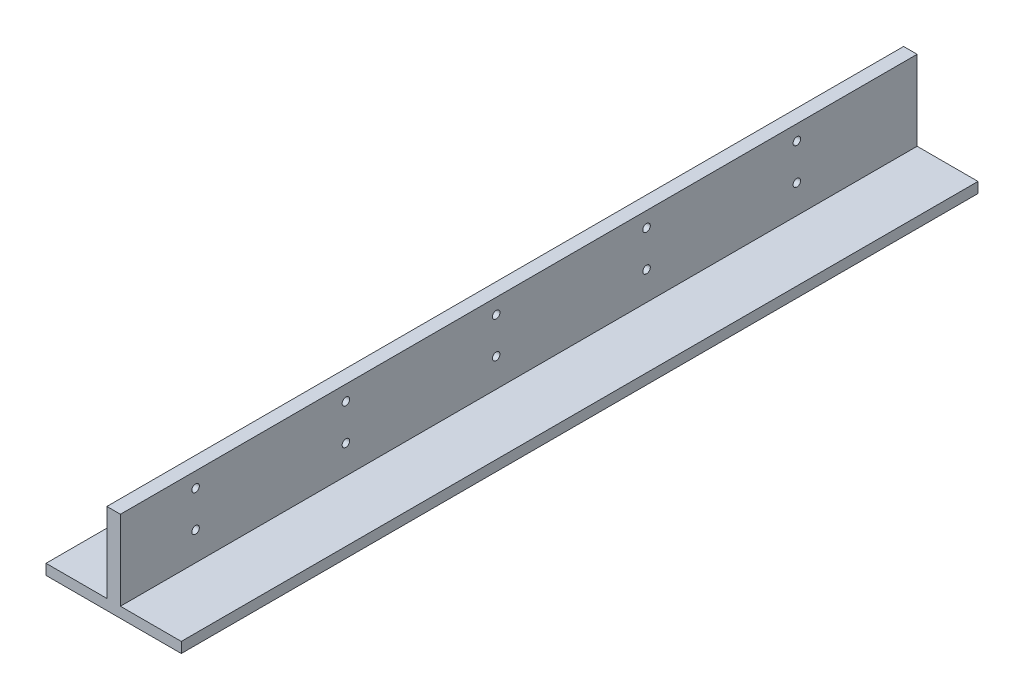
ISO-10303-21;
HEADER;
FILE_DESCRIPTION(('STEP AP214'),'2;1');
FILE_NAME('part.step','',(''),(''),'','','');
FILE_SCHEMA(('AUTOMOTIVE_DESIGN { 1 0 10303 214 1 1 1 1 }'));
ENDSEC;
DATA;
#1=APPLICATION_CONTEXT('core data for automotive mechanical design processes');
#2=APPLICATION_PROTOCOL_DEFINITION('international standard','automotive_design',2000,#1);
#3=PRODUCT_CONTEXT('',#1,'mechanical');
#4=PRODUCT('Part','Part','',(#3));
#5=PRODUCT_RELATED_PRODUCT_CATEGORY('part','',(#4));
#6=PRODUCT_DEFINITION_FORMATION('','',#4);
#7=PRODUCT_DEFINITION_CONTEXT('part definition',#1,'design');
#8=PRODUCT_DEFINITION('design','',#6,#7);
#9=PRODUCT_DEFINITION_SHAPE('','',#8);
#10=(LENGTH_UNIT() NAMED_UNIT(*) SI_UNIT(.MILLI.,.METRE.));
#11=(NAMED_UNIT(*) PLANE_ANGLE_UNIT() SI_UNIT($,.RADIAN.));
#12=(NAMED_UNIT(*) SI_UNIT($,.STERADIAN.) SOLID_ANGLE_UNIT());
#13=UNCERTAINTY_MEASURE_WITH_UNIT(LENGTH_MEASURE(1.E-05),#10,'distance_accuracy_value','');
#14=(GEOMETRIC_REPRESENTATION_CONTEXT(3) GLOBAL_UNCERTAINTY_ASSIGNED_CONTEXT((#13)) GLOBAL_UNIT_ASSIGNED_CONTEXT((#10,
#11,#12)) REPRESENTATION_CONTEXT('',''));
#15=CARTESIAN_POINT('',(0.,0.,0.));
#16=DIRECTION('',(0.,0.,1.));
#17=DIRECTION('',(1.,0.,0.));
#18=AXIS2_PLACEMENT_3D('',#15,#16,#17);
#19=CARTESIAN_POINT('',(0.,7.,530.));
#20=DIRECTION('',(1.,0.,0.));
#21=DIRECTION('',(0.,0.,-1.));
#22=AXIS2_PLACEMENT_3D('',#19,#20,#21);
#23=PLANE('',#22);
#24=DIRECTION('',(0.,-1.,0.));
#25=VECTOR('',#24,1.);
#26=CARTESIAN_POINT('',(0.,7.,0.));
#27=LINE('',#26,#25);
#28=CARTESIAN_POINT('',(0.,7.,0.));
#29=VERTEX_POINT('',#28);
#30=CARTESIAN_POINT('',(0.,0.,0.));
#31=VERTEX_POINT('',#30);
#32=EDGE_CURVE('E129',#29,#31,#27,.T.);
#33=ORIENTED_EDGE('',*,*,#32,.T.);
#34=DIRECTION('',(0.,0.,-1.));
#35=VECTOR('',#34,1.);
#36=CARTESIAN_POINT('',(0.,0.,530.));
#37=LINE('',#36,#35);
#38=CARTESIAN_POINT('',(0.,0.,530.));
#39=VERTEX_POINT('',#38);
#40=EDGE_CURVE('E11',#39,#31,#37,.T.);
#41=ORIENTED_EDGE('',*,*,#40,.F.);
#42=DIRECTION('',(0.,-1.,0.));
#43=VECTOR('',#42,1.);
#44=CARTESIAN_POINT('',(0.,7.,530.));
#45=LINE('',#44,#43);
#46=CARTESIAN_POINT('',(0.,7.,530.));
#47=VERTEX_POINT('',#46);
#48=EDGE_CURVE('E144',#47,#39,#45,.T.);
#49=ORIENTED_EDGE('',*,*,#48,.F.);
#50=DIRECTION('',(0.,0.,-1.));
#51=VECTOR('',#50,1.);
#52=CARTESIAN_POINT('',(0.,7.,530.));
#53=LINE('',#52,#51);
#54=EDGE_CURVE('E125',#47,#29,#53,.T.);
#55=ORIENTED_EDGE('',*,*,#54,.T.);
#56=EDGE_LOOP('',(#33,#41,#49,#55));
#57=FACE_BOUND('',#56,.T.);
#58=ADVANCED_FACE('F33',(#57),#23,.F.);
#59=CARTESIAN_POINT('',(0.,0.,530.));
#60=DIRECTION('',(0.,1.,0.));
#61=DIRECTION('',(0.,0.,1.));
#62=AXIS2_PLACEMENT_3D('',#59,#60,#61);
#63=PLANE('',#62);
#64=DIRECTION('',(1.,0.,0.));
#65=VECTOR('',#64,1.);
#66=CARTESIAN_POINT('',(0.,0.,0.));
#67=LINE('',#66,#65);
#68=CARTESIAN_POINT('',(90.,0.,0.));
#69=VERTEX_POINT('',#68);
#70=EDGE_CURVE('E132',#31,#69,#67,.T.);
#71=ORIENTED_EDGE('',*,*,#70,.T.);
#72=DIRECTION('',(0.,0.,-1.));
#73=VECTOR('',#72,1.);
#74=CARTESIAN_POINT('',(90.,0.,530.));
#75=LINE('',#74,#73);
#76=CARTESIAN_POINT('',(90.,0.,530.));
#77=VERTEX_POINT('',#76);
#78=EDGE_CURVE('E41',#77,#69,#75,.T.);
#79=ORIENTED_EDGE('',*,*,#78,.F.);
#80=DIRECTION('',(1.,0.,0.));
#81=VECTOR('',#80,1.);
#82=CARTESIAN_POINT('',(0.,0.,530.));
#83=LINE('',#82,#81);
#84=EDGE_CURVE('E92',#39,#77,#83,.T.);
#85=ORIENTED_EDGE('',*,*,#84,.F.);
#86=ORIENTED_EDGE('',*,*,#40,.T.);
#87=EDGE_LOOP('',(#71,#79,#85,#86));
#88=FACE_BOUND('',#87,.T.);
#89=ADVANCED_FACE('F284',(#88),#63,.F.);
#90=CARTESIAN_POINT('',(90.,0.,530.));
#91=DIRECTION('',(-1.,0.,0.));
#92=DIRECTION('',(0.,-1.,0.));
#93=AXIS2_PLACEMENT_3D('',#90,#91,#92);
#94=PLANE('',#93);
#95=DIRECTION('',(0.,1.,0.));
#96=VECTOR('',#95,1.);
#97=CARTESIAN_POINT('',(90.,0.,0.));
#98=LINE('',#97,#96);
#99=CARTESIAN_POINT('',(90.,7.,0.));
#100=VERTEX_POINT('',#99);
#101=EDGE_CURVE('E135',#69,#100,#98,.T.);
#102=ORIENTED_EDGE('',*,*,#101,.T.);
#103=DIRECTION('',(0.,0.,-1.));
#104=VECTOR('',#103,1.);
#105=CARTESIAN_POINT('',(90.,7.,530.));
#106=LINE('',#105,#104);
#107=CARTESIAN_POINT('',(90.,7.,530.));
#108=VERTEX_POINT('',#107);
#109=EDGE_CURVE('E151',#108,#100,#106,.T.);
#110=ORIENTED_EDGE('',*,*,#109,.F.);
#111=DIRECTION('',(0.,1.,0.));
#112=VECTOR('',#111,1.);
#113=CARTESIAN_POINT('',(90.,0.,530.));
#114=LINE('',#113,#112);
#115=EDGE_CURVE('E159',#77,#108,#114,.T.);
#116=ORIENTED_EDGE('',*,*,#115,.F.);
#117=ORIENTED_EDGE('',*,*,#78,.T.);
#118=EDGE_LOOP('',(#102,#110,#116,#117));
#119=FACE_BOUND('',#118,.T.);
#120=ADVANCED_FACE('F157',(#119),#94,.F.);
#121=CARTESIAN_POINT('',(90.,7.,530.));
#122=DIRECTION('',(0.,-1.,0.));
#123=DIRECTION('',(0.,0.,-1.));
#124=AXIS2_PLACEMENT_3D('',#121,#122,#123);
#125=PLANE('',#124);
#126=DIRECTION('',(-1.,0.,0.));
#127=VECTOR('',#126,1.);
#128=CARTESIAN_POINT('',(90.,7.,0.));
#129=LINE('',#128,#127);
#130=CARTESIAN_POINT('',(49.5,7.,0.));
#131=VERTEX_POINT('',#130);
#132=EDGE_CURVE('E137',#100,#131,#129,.T.);
#133=ORIENTED_EDGE('',*,*,#132,.T.);
#134=DIRECTION('',(0.,0.,-1.));
#135=VECTOR('',#134,1.);
#136=CARTESIAN_POINT('',(49.5,7.,530.));
#137=LINE('',#136,#135);
#138=CARTESIAN_POINT('',(49.5,7.,530.));
#139=VERTEX_POINT('',#138);
#140=EDGE_CURVE('E148',#139,#131,#137,.T.);
#141=ORIENTED_EDGE('',*,*,#140,.F.);
#142=DIRECTION('',(-1.,0.,0.));
#143=VECTOR('',#142,1.);
#144=CARTESIAN_POINT('',(90.,7.,530.));
#145=LINE('',#144,#143);
#146=EDGE_CURVE('E171',#108,#139,#145,.T.);
#147=ORIENTED_EDGE('',*,*,#146,.F.);
#148=ORIENTED_EDGE('',*,*,#109,.T.);
#149=EDGE_LOOP('',(#133,#141,#147,#148));
#150=FACE_BOUND('',#149,.T.);
#151=ADVANCED_FACE('F167',(#150),#125,.F.);
#152=CARTESIAN_POINT('',(49.5,7.,530.));
#153=DIRECTION('',(-1.,0.,0.));
#154=DIRECTION('',(0.,-1.,0.));
#155=AXIS2_PLACEMENT_3D('',#152,#153,#154);
#156=PLANE('',#155);
#157=CARTESIAN_POINT('',(49.5,26.,480.));
#158=DIRECTION('',(-1.,0.,0.));
#159=DIRECTION('',(0.,1.,0.));
#160=AXIS2_PLACEMENT_3D('',#157,#158,#159);
#161=CIRCLE('',#160,2.50000000000002);
#162=CARTESIAN_POINT('',(49.5,28.5,480.));
#163=VERTEX_POINT('',#162);
#164=EDGE_CURVE('E228',#163,#163,#161,.T.);
#165=ORIENTED_EDGE('',*,*,#164,.T.);
#166=EDGE_LOOP('',(#165));
#167=FACE_BOUND('',#166,.T.);
#168=CARTESIAN_POINT('',(49.5,50.,480.));
#169=DIRECTION('',(-1.,0.,0.));
#170=DIRECTION('',(0.,-1.,0.));
#171=AXIS2_PLACEMENT_3D('',#168,#169,#170);
#172=CIRCLE('',#171,2.50000000000002);
#173=CARTESIAN_POINT('',(49.5,47.5,480.));
#174=VERTEX_POINT('',#173);
#175=EDGE_CURVE('E222',#174,#174,#172,.T.);
#176=ORIENTED_EDGE('',*,*,#175,.T.);
#177=EDGE_LOOP('',(#176));
#178=FACE_BOUND('',#177,.T.);
#179=CARTESIAN_POINT('',(49.5,26.,380.));
#180=DIRECTION('',(-1.,0.,0.));
#181=DIRECTION('',(0.,1.,0.));
#182=AXIS2_PLACEMENT_3D('',#179,#180,#181);
#183=CIRCLE('',#182,2.50000000000002);
#184=CARTESIAN_POINT('',(49.5,28.5,380.));
#185=VERTEX_POINT('',#184);
#186=EDGE_CURVE('E216',#185,#185,#183,.T.);
#187=ORIENTED_EDGE('',*,*,#186,.T.);
#188=EDGE_LOOP('',(#187));
#189=FACE_BOUND('',#188,.T.);
#190=CARTESIAN_POINT('',(49.5,50.,380.));
#191=DIRECTION('',(-1.,0.,0.));
#192=DIRECTION('',(0.,-1.,0.));
#193=AXIS2_PLACEMENT_3D('',#190,#191,#192);
#194=CIRCLE('',#193,2.50000000000002);
#195=CARTESIAN_POINT('',(49.5,47.5,380.));
#196=VERTEX_POINT('',#195);
#197=EDGE_CURVE('E210',#196,#196,#194,.T.);
#198=ORIENTED_EDGE('',*,*,#197,.T.);
#199=EDGE_LOOP('',(#198));
#200=FACE_BOUND('',#199,.T.);
#201=CARTESIAN_POINT('',(49.5,26.,280.));
#202=DIRECTION('',(-1.,0.,0.));
#203=DIRECTION('',(0.,1.,0.));
#204=AXIS2_PLACEMENT_3D('',#201,#202,#203);
#205=CIRCLE('',#204,2.50000000000002);
#206=CARTESIAN_POINT('',(49.5,28.5,280.));
#207=VERTEX_POINT('',#206);
#208=EDGE_CURVE('E204',#207,#207,#205,.T.);
#209=ORIENTED_EDGE('',*,*,#208,.T.);
#210=EDGE_LOOP('',(#209));
#211=FACE_BOUND('',#210,.T.);
#212=CARTESIAN_POINT('',(49.5,50.,280.));
#213=DIRECTION('',(-1.,0.,0.));
#214=DIRECTION('',(0.,-1.,0.));
#215=AXIS2_PLACEMENT_3D('',#212,#213,#214);
#216=CIRCLE('',#215,2.50000000000002);
#217=CARTESIAN_POINT('',(49.5,47.5,280.));
#218=VERTEX_POINT('',#217);
#219=EDGE_CURVE('E198',#218,#218,#216,.T.);
#220=ORIENTED_EDGE('',*,*,#219,.T.);
#221=EDGE_LOOP('',(#220));
#222=FACE_BOUND('',#221,.T.);
#223=CARTESIAN_POINT('',(49.5,26.,180.));
#224=DIRECTION('',(-1.,0.,0.));
#225=DIRECTION('',(0.,1.,0.));
#226=AXIS2_PLACEMENT_3D('',#223,#224,#225);
#227=CIRCLE('',#226,2.5);
#228=CARTESIAN_POINT('',(49.5,28.5,180.));
#229=VERTEX_POINT('',#228);
#230=EDGE_CURVE('E192',#229,#229,#227,.T.);
#231=ORIENTED_EDGE('',*,*,#230,.T.);
#232=EDGE_LOOP('',(#231));
#233=FACE_BOUND('',#232,.T.);
#234=CARTESIAN_POINT('',(49.5,50.,180.));
#235=DIRECTION('',(-1.,0.,0.));
#236=DIRECTION('',(0.,-1.,0.));
#237=AXIS2_PLACEMENT_3D('',#234,#235,#236);
#238=CIRCLE('',#237,2.5);
#239=CARTESIAN_POINT('',(49.5,47.5,180.));
#240=VERTEX_POINT('',#239);
#241=EDGE_CURVE('E186',#240,#240,#238,.T.);
#242=ORIENTED_EDGE('',*,*,#241,.T.);
#243=EDGE_LOOP('',(#242));
#244=FACE_BOUND('',#243,.T.);
#245=CARTESIAN_POINT('',(49.5,26.,80.));
#246=DIRECTION('',(-1.,0.,0.));
#247=DIRECTION('',(0.,1.,0.));
#248=AXIS2_PLACEMENT_3D('',#245,#246,#247);
#249=CIRCLE('',#248,2.50000000000001);
#250=CARTESIAN_POINT('',(49.5,28.5,80.));
#251=VERTEX_POINT('',#250);
#252=EDGE_CURVE('E180',#251,#251,#249,.T.);
#253=ORIENTED_EDGE('',*,*,#252,.T.);
#254=EDGE_LOOP('',(#253));
#255=FACE_BOUND('',#254,.T.);
#256=CARTESIAN_POINT('',(49.5,50.,80.));
#257=DIRECTION('',(-1.,0.,0.));
#258=DIRECTION('',(0.,-1.,0.));
#259=AXIS2_PLACEMENT_3D('',#256,#257,#258);
#260=CIRCLE('',#259,2.50000000000001);
#261=CARTESIAN_POINT('',(49.5,47.5,80.));
#262=VERTEX_POINT('',#261);
#263=EDGE_CURVE('E133',#262,#262,#260,.T.);
#264=ORIENTED_EDGE('',*,*,#263,.T.);
#265=EDGE_LOOP('',(#264));
#266=FACE_BOUND('',#265,.T.);
#267=DIRECTION('',(0.,1.,0.));
#268=VECTOR('',#267,1.);
#269=CARTESIAN_POINT('',(49.5,7.,0.));
#270=LINE('',#269,#268);
#271=CARTESIAN_POINT('',(49.5,60.,0.));
#272=VERTEX_POINT('',#271);
#273=EDGE_CURVE('E139',#131,#272,#270,.T.);
#274=ORIENTED_EDGE('',*,*,#273,.T.);
#275=DIRECTION('',(0.,0.,-1.));
#276=VECTOR('',#275,1.);
#277=CARTESIAN_POINT('',(49.5,60.,530.));
#278=LINE('',#277,#276);
#279=CARTESIAN_POINT('',(49.5,60.,530.));
#280=VERTEX_POINT('',#279);
#281=EDGE_CURVE('E120',#280,#272,#278,.T.);
#282=ORIENTED_EDGE('',*,*,#281,.F.);
#283=DIRECTION('',(0.,1.,0.));
#284=VECTOR('',#283,1.);
#285=CARTESIAN_POINT('',(49.5,7.,530.));
#286=LINE('',#285,#284);
#287=EDGE_CURVE('E111',#139,#280,#286,.T.);
#288=ORIENTED_EDGE('',*,*,#287,.F.);
#289=ORIENTED_EDGE('',*,*,#140,.T.);
#290=EDGE_LOOP('',(#274,#282,#288,#289));
#291=FACE_BOUND('',#290,.T.);
#292=ADVANCED_FACE('F170',(#167,#178,#189,#200,#211,#222,#233,#244,#255,#266,#291),#156,.F.);
#293=CARTESIAN_POINT('',(49.5,60.,530.));
#294=DIRECTION('',(0.,-1.,0.));
#295=DIRECTION('',(0.,0.,-1.));
#296=AXIS2_PLACEMENT_3D('',#293,#294,#295);
#297=PLANE('',#296);
#298=DIRECTION('',(-1.,0.,0.));
#299=VECTOR('',#298,1.);
#300=CARTESIAN_POINT('',(49.5,60.,0.));
#301=LINE('',#300,#299);
#302=CARTESIAN_POINT('',(40.5,60.,0.));
#303=VERTEX_POINT('',#302);
#304=EDGE_CURVE('E119',#272,#303,#301,.T.);
#305=ORIENTED_EDGE('',*,*,#304,.T.);
#306=DIRECTION('',(0.,0.,-1.));
#307=VECTOR('',#306,1.);
#308=CARTESIAN_POINT('',(40.5,60.,530.));
#309=LINE('',#308,#307);
#310=CARTESIAN_POINT('',(40.5,60.,530.));
#311=VERTEX_POINT('',#310);
#312=EDGE_CURVE('E116',#311,#303,#309,.T.);
#313=ORIENTED_EDGE('',*,*,#312,.F.);
#314=DIRECTION('',(-1.,0.,0.));
#315=VECTOR('',#314,1.);
#316=CARTESIAN_POINT('',(49.5,60.,530.));
#317=LINE('',#316,#315);
#318=EDGE_CURVE('E105',#280,#311,#317,.T.);
#319=ORIENTED_EDGE('',*,*,#318,.F.);
#320=ORIENTED_EDGE('',*,*,#281,.T.);
#321=EDGE_LOOP('',(#305,#313,#319,#320));
#322=FACE_BOUND('',#321,.T.);
#323=ADVANCED_FACE('F117',(#322),#297,.F.);
#324=CARTESIAN_POINT('',(40.5,60.,530.));
#325=DIRECTION('',(1.,0.,0.));
#326=DIRECTION('',(0.,1.,0.));
#327=AXIS2_PLACEMENT_3D('',#324,#325,#326);
#328=PLANE('',#327);
#329=CARTESIAN_POINT('',(40.5,26.,480.));
#330=DIRECTION('',(-1.,0.,0.));
#331=DIRECTION('',(0.,1.,0.));
#332=AXIS2_PLACEMENT_3D('',#329,#330,#331);
#333=CIRCLE('',#332,2.50000000000002);
#334=CARTESIAN_POINT('',(40.5,28.5,480.));
#335=VERTEX_POINT('',#334);
#336=EDGE_CURVE('E231',#335,#335,#333,.T.);
#337=ORIENTED_EDGE('',*,*,#336,.F.);
#338=EDGE_LOOP('',(#337));
#339=FACE_BOUND('',#338,.T.);
#340=CARTESIAN_POINT('',(40.5,50.,480.));
#341=DIRECTION('',(-1.,0.,0.));
#342=DIRECTION('',(0.,-1.,0.));
#343=AXIS2_PLACEMENT_3D('',#340,#341,#342);
#344=CIRCLE('',#343,2.50000000000002);
#345=CARTESIAN_POINT('',(40.5,47.5,480.));
#346=VERTEX_POINT('',#345);
#347=EDGE_CURVE('E225',#346,#346,#344,.T.);
#348=ORIENTED_EDGE('',*,*,#347,.F.);
#349=EDGE_LOOP('',(#348));
#350=FACE_BOUND('',#349,.T.);
#351=CARTESIAN_POINT('',(40.5,26.,380.));
#352=DIRECTION('',(-1.,0.,0.));
#353=DIRECTION('',(0.,1.,0.));
#354=AXIS2_PLACEMENT_3D('',#351,#352,#353);
#355=CIRCLE('',#354,2.50000000000002);
#356=CARTESIAN_POINT('',(40.5,28.5,380.));
#357=VERTEX_POINT('',#356);
#358=EDGE_CURVE('E219',#357,#357,#355,.T.);
#359=ORIENTED_EDGE('',*,*,#358,.F.);
#360=EDGE_LOOP('',(#359));
#361=FACE_BOUND('',#360,.T.);
#362=CARTESIAN_POINT('',(40.5,50.,380.));
#363=DIRECTION('',(-1.,0.,0.));
#364=DIRECTION('',(0.,-1.,0.));
#365=AXIS2_PLACEMENT_3D('',#362,#363,#364);
#366=CIRCLE('',#365,2.50000000000002);
#367=CARTESIAN_POINT('',(40.5,47.5,380.));
#368=VERTEX_POINT('',#367);
#369=EDGE_CURVE('E213',#368,#368,#366,.T.);
#370=ORIENTED_EDGE('',*,*,#369,.F.);
#371=EDGE_LOOP('',(#370));
#372=FACE_BOUND('',#371,.T.);
#373=CARTESIAN_POINT('',(40.5,26.,280.));
#374=DIRECTION('',(-1.,0.,0.));
#375=DIRECTION('',(0.,1.,0.));
#376=AXIS2_PLACEMENT_3D('',#373,#374,#375);
#377=CIRCLE('',#376,2.50000000000002);
#378=CARTESIAN_POINT('',(40.5,28.5,280.));
#379=VERTEX_POINT('',#378);
#380=EDGE_CURVE('E207',#379,#379,#377,.T.);
#381=ORIENTED_EDGE('',*,*,#380,.F.);
#382=EDGE_LOOP('',(#381));
#383=FACE_BOUND('',#382,.T.);
#384=CARTESIAN_POINT('',(40.5,50.,280.));
#385=DIRECTION('',(-1.,0.,0.));
#386=DIRECTION('',(0.,-1.,0.));
#387=AXIS2_PLACEMENT_3D('',#384,#385,#386);
#388=CIRCLE('',#387,2.50000000000002);
#389=CARTESIAN_POINT('',(40.5,47.5,280.));
#390=VERTEX_POINT('',#389);
#391=EDGE_CURVE('E201',#390,#390,#388,.T.);
#392=ORIENTED_EDGE('',*,*,#391,.F.);
#393=EDGE_LOOP('',(#392));
#394=FACE_BOUND('',#393,.T.);
#395=CARTESIAN_POINT('',(40.5,26.,180.));
#396=DIRECTION('',(-1.,0.,0.));
#397=DIRECTION('',(0.,1.,0.));
#398=AXIS2_PLACEMENT_3D('',#395,#396,#397);
#399=CIRCLE('',#398,2.5);
#400=CARTESIAN_POINT('',(40.5,28.5,180.));
#401=VERTEX_POINT('',#400);
#402=EDGE_CURVE('E195',#401,#401,#399,.T.);
#403=ORIENTED_EDGE('',*,*,#402,.F.);
#404=EDGE_LOOP('',(#403));
#405=FACE_BOUND('',#404,.T.);
#406=CARTESIAN_POINT('',(40.5,50.,180.));
#407=DIRECTION('',(-1.,0.,0.));
#408=DIRECTION('',(0.,-1.,0.));
#409=AXIS2_PLACEMENT_3D('',#406,#407,#408);
#410=CIRCLE('',#409,2.5);
#411=CARTESIAN_POINT('',(40.5,47.5,180.));
#412=VERTEX_POINT('',#411);
#413=EDGE_CURVE('E189',#412,#412,#410,.T.);
#414=ORIENTED_EDGE('',*,*,#413,.F.);
#415=EDGE_LOOP('',(#414));
#416=FACE_BOUND('',#415,.T.);
#417=CARTESIAN_POINT('',(40.5,26.,80.));
#418=DIRECTION('',(-1.,0.,0.));
#419=DIRECTION('',(0.,1.,0.));
#420=AXIS2_PLACEMENT_3D('',#417,#418,#419);
#421=CIRCLE('',#420,2.50000000000001);
#422=CARTESIAN_POINT('',(40.5,28.5,80.));
#423=VERTEX_POINT('',#422);
#424=EDGE_CURVE('E183',#423,#423,#421,.T.);
#425=ORIENTED_EDGE('',*,*,#424,.F.);
#426=EDGE_LOOP('',(#425));
#427=FACE_BOUND('',#426,.T.);
#428=CARTESIAN_POINT('',(40.5,50.,80.));
#429=DIRECTION('',(-1.,0.,0.));
#430=DIRECTION('',(0.,-1.,0.));
#431=AXIS2_PLACEMENT_3D('',#428,#429,#430);
#432=CIRCLE('',#431,2.50000000000001);
#433=CARTESIAN_POINT('',(40.5,47.5,80.));
#434=VERTEX_POINT('',#433);
#435=EDGE_CURVE('E177',#434,#434,#432,.T.);
#436=ORIENTED_EDGE('',*,*,#435,.F.);
#437=EDGE_LOOP('',(#436));
#438=FACE_BOUND('',#437,.T.);
#439=DIRECTION('',(0.,-1.,0.));
#440=VECTOR('',#439,1.);
#441=CARTESIAN_POINT('',(40.5,60.,0.));
#442=LINE('',#441,#440);
#443=CARTESIAN_POINT('',(40.5,7.,0.));
#444=VERTEX_POINT('',#443);
#445=EDGE_CURVE('E78',#303,#444,#442,.T.);
#446=ORIENTED_EDGE('',*,*,#445,.T.);
#447=DIRECTION('',(0.,0.,-1.));
#448=VECTOR('',#447,1.);
#449=CARTESIAN_POINT('',(40.5,7.,530.));
#450=LINE('',#449,#448);
#451=CARTESIAN_POINT('',(40.5,7.,530.));
#452=VERTEX_POINT('',#451);
#453=EDGE_CURVE('E121',#452,#444,#450,.T.);
#454=ORIENTED_EDGE('',*,*,#453,.F.);
#455=DIRECTION('',(0.,-1.,0.));
#456=VECTOR('',#455,1.);
#457=CARTESIAN_POINT('',(40.5,60.,530.));
#458=LINE('',#457,#456);
#459=EDGE_CURVE('E109',#311,#452,#458,.T.);
#460=ORIENTED_EDGE('',*,*,#459,.F.);
#461=ORIENTED_EDGE('',*,*,#312,.T.);
#462=EDGE_LOOP('',(#446,#454,#460,#461));
#463=FACE_BOUND('',#462,.T.);
#464=ADVANCED_FACE('F123',(#339,#350,#361,#372,#383,#394,#405,#416,#427,#438,#463),#328,.F.);
#465=CARTESIAN_POINT('',(40.5,7.,530.));
#466=DIRECTION('',(0.,-1.,0.));
#467=DIRECTION('',(0.,0.,-1.));
#468=AXIS2_PLACEMENT_3D('',#465,#466,#467);
#469=PLANE('',#468);
#470=DIRECTION('',(-1.,0.,0.));
#471=VECTOR('',#470,1.);
#472=CARTESIAN_POINT('',(40.5,7.,0.));
#473=LINE('',#472,#471);
#474=EDGE_CURVE('E84',#444,#29,#473,.T.);
#475=ORIENTED_EDGE('',*,*,#474,.T.);
#476=ORIENTED_EDGE('',*,*,#54,.F.);
#477=DIRECTION('',(-1.,0.,0.));
#478=VECTOR('',#477,1.);
#479=CARTESIAN_POINT('',(40.5,7.,530.));
#480=LINE('',#479,#478);
#481=EDGE_CURVE('E49',#452,#47,#480,.T.);
#482=ORIENTED_EDGE('',*,*,#481,.F.);
#483=ORIENTED_EDGE('',*,*,#453,.T.);
#484=EDGE_LOOP('',(#475,#476,#482,#483));
#485=FACE_BOUND('',#484,.T.);
#486=ADVANCED_FACE('F248',(#485),#469,.F.);
#487=CARTESIAN_POINT('',(0.,0.,530.));
#488=DIRECTION('',(0.,0.,1.));
#489=DIRECTION('',(1.,0.,0.));
#490=AXIS2_PLACEMENT_3D('',#487,#488,#489);
#491=PLANE('',#490);
#492=ORIENTED_EDGE('',*,*,#48,.T.);
#493=ORIENTED_EDGE('',*,*,#84,.T.);
#494=ORIENTED_EDGE('',*,*,#115,.T.);
#495=ORIENTED_EDGE('',*,*,#146,.T.);
#496=ORIENTED_EDGE('',*,*,#287,.T.);
#497=ORIENTED_EDGE('',*,*,#318,.T.);
#498=ORIENTED_EDGE('',*,*,#459,.T.);
#499=ORIENTED_EDGE('',*,*,#481,.T.);
#500=EDGE_LOOP('',(#492,#493,#494,#495,#496,#497,#498,#499));
#501=FACE_BOUND('',#500,.T.);
#502=ADVANCED_FACE('F107',(#501),#491,.T.);
#503=CARTESIAN_POINT('',(0.,0.,0.));
#504=DIRECTION('',(0.,0.,1.));
#505=DIRECTION('',(1.,0.,0.));
#506=AXIS2_PLACEMENT_3D('',#503,#504,#505);
#507=PLANE('',#506);
#508=ORIENTED_EDGE('',*,*,#32,.F.);
#509=ORIENTED_EDGE('',*,*,#474,.F.);
#510=ORIENTED_EDGE('',*,*,#445,.F.);
#511=ORIENTED_EDGE('',*,*,#304,.F.);
#512=ORIENTED_EDGE('',*,*,#273,.F.);
#513=ORIENTED_EDGE('',*,*,#132,.F.);
#514=ORIENTED_EDGE('',*,*,#101,.F.);
#515=ORIENTED_EDGE('',*,*,#70,.F.);
#516=EDGE_LOOP('',(#508,#509,#510,#511,#512,#513,#514,#515));
#517=FACE_BOUND('',#516,.T.);
#518=ADVANCED_FACE('F163',(#517),#507,.F.);
#519=CARTESIAN_POINT('',(49.5,50.,80.));
#520=DIRECTION('',(-1.,0.,0.));
#521=DIRECTION('',(0.,-1.,0.));
#522=AXIS2_PLACEMENT_3D('',#519,#520,#521);
#523=CYLINDRICAL_SURFACE('',#522,2.50000000000001);
#524=ORIENTED_EDGE('',*,*,#263,.F.);
#525=EDGE_LOOP('',(#524));
#526=FACE_BOUND('',#525,.T.);
#527=ORIENTED_EDGE('',*,*,#435,.T.);
#528=EDGE_LOOP('',(#527));
#529=FACE_BOUND('',#528,.T.);
#530=ADVANCED_FACE('F268',(#526,#529),#523,.F.);
#531=CARTESIAN_POINT('',(49.5,26.,80.));
#532=DIRECTION('',(-1.,0.,0.));
#533=DIRECTION('',(0.,-1.,0.));
#534=AXIS2_PLACEMENT_3D('',#531,#532,#533);
#535=CYLINDRICAL_SURFACE('',#534,2.50000000000001);
#536=ORIENTED_EDGE('',*,*,#252,.F.);
#537=EDGE_LOOP('',(#536));
#538=FACE_BOUND('',#537,.T.);
#539=ORIENTED_EDGE('',*,*,#424,.T.);
#540=EDGE_LOOP('',(#539));
#541=FACE_BOUND('',#540,.T.);
#542=ADVANCED_FACE('F270',(#538,#541),#535,.F.);
#543=CARTESIAN_POINT('',(49.5,50.,180.));
#544=DIRECTION('',(-1.,0.,0.));
#545=DIRECTION('',(0.,-1.,0.));
#546=AXIS2_PLACEMENT_3D('',#543,#544,#545);
#547=CYLINDRICAL_SURFACE('',#546,2.5);
#548=ORIENTED_EDGE('',*,*,#241,.F.);
#549=EDGE_LOOP('',(#548));
#550=FACE_BOUND('',#549,.T.);
#551=ORIENTED_EDGE('',*,*,#413,.T.);
#552=EDGE_LOOP('',(#551));
#553=FACE_BOUND('',#552,.T.);
#554=ADVANCED_FACE('F277',(#550,#553),#547,.F.);
#555=CARTESIAN_POINT('',(49.5,26.,180.));
#556=DIRECTION('',(-1.,0.,0.));
#557=DIRECTION('',(0.,-1.,0.));
#558=AXIS2_PLACEMENT_3D('',#555,#556,#557);
#559=CYLINDRICAL_SURFACE('',#558,2.5);
#560=ORIENTED_EDGE('',*,*,#230,.F.);
#561=EDGE_LOOP('',(#560));
#562=FACE_BOUND('',#561,.T.);
#563=ORIENTED_EDGE('',*,*,#402,.T.);
#564=EDGE_LOOP('',(#563));
#565=FACE_BOUND('',#564,.T.);
#566=ADVANCED_FACE('F346',(#562,#565),#559,.F.);
#567=CARTESIAN_POINT('',(49.5,50.,280.));
#568=DIRECTION('',(-1.,0.,0.));
#569=DIRECTION('',(0.,-1.,0.));
#570=AXIS2_PLACEMENT_3D('',#567,#568,#569);
#571=CYLINDRICAL_SURFACE('',#570,2.50000000000002);
#572=ORIENTED_EDGE('',*,*,#219,.F.);
#573=EDGE_LOOP('',(#572));
#574=FACE_BOUND('',#573,.T.);
#575=ORIENTED_EDGE('',*,*,#391,.T.);
#576=EDGE_LOOP('',(#575));
#577=FACE_BOUND('',#576,.T.);
#578=ADVANCED_FACE('F356',(#574,#577),#571,.F.);
#579=CARTESIAN_POINT('',(49.5,26.,280.));
#580=DIRECTION('',(-1.,0.,0.));
#581=DIRECTION('',(0.,-1.,0.));
#582=AXIS2_PLACEMENT_3D('',#579,#580,#581);
#583=CYLINDRICAL_SURFACE('',#582,2.50000000000002);
#584=ORIENTED_EDGE('',*,*,#208,.F.);
#585=EDGE_LOOP('',(#584));
#586=FACE_BOUND('',#585,.T.);
#587=ORIENTED_EDGE('',*,*,#380,.T.);
#588=EDGE_LOOP('',(#587));
#589=FACE_BOUND('',#588,.T.);
#590=ADVANCED_FACE('F366',(#586,#589),#583,.F.);
#591=CARTESIAN_POINT('',(49.5,50.,380.));
#592=DIRECTION('',(-1.,0.,0.));
#593=DIRECTION('',(0.,-1.,0.));
#594=AXIS2_PLACEMENT_3D('',#591,#592,#593);
#595=CYLINDRICAL_SURFACE('',#594,2.50000000000002);
#596=ORIENTED_EDGE('',*,*,#197,.F.);
#597=EDGE_LOOP('',(#596));
#598=FACE_BOUND('',#597,.T.);
#599=ORIENTED_EDGE('',*,*,#369,.T.);
#600=EDGE_LOOP('',(#599));
#601=FACE_BOUND('',#600,.T.);
#602=ADVANCED_FACE('F376',(#598,#601),#595,.F.);
#603=CARTESIAN_POINT('',(49.5,26.,380.));
#604=DIRECTION('',(-1.,0.,0.));
#605=DIRECTION('',(0.,-1.,0.));
#606=AXIS2_PLACEMENT_3D('',#603,#604,#605);
#607=CYLINDRICAL_SURFACE('',#606,2.50000000000002);
#608=ORIENTED_EDGE('',*,*,#186,.F.);
#609=EDGE_LOOP('',(#608));
#610=FACE_BOUND('',#609,.T.);
#611=ORIENTED_EDGE('',*,*,#358,.T.);
#612=EDGE_LOOP('',(#611));
#613=FACE_BOUND('',#612,.T.);
#614=ADVANCED_FACE('F386',(#610,#613),#607,.F.);
#615=CARTESIAN_POINT('',(49.5,50.,480.));
#616=DIRECTION('',(-1.,0.,0.));
#617=DIRECTION('',(0.,-1.,0.));
#618=AXIS2_PLACEMENT_3D('',#615,#616,#617);
#619=CYLINDRICAL_SURFACE('',#618,2.50000000000002);
#620=ORIENTED_EDGE('',*,*,#175,.F.);
#621=EDGE_LOOP('',(#620));
#622=FACE_BOUND('',#621,.T.);
#623=ORIENTED_EDGE('',*,*,#347,.T.);
#624=EDGE_LOOP('',(#623));
#625=FACE_BOUND('',#624,.T.);
#626=ADVANCED_FACE('F242',(#622,#625),#619,.F.);
#627=CARTESIAN_POINT('',(49.5,26.,480.));
#628=DIRECTION('',(-1.,0.,0.));
#629=DIRECTION('',(0.,-1.,0.));
#630=AXIS2_PLACEMENT_3D('',#627,#628,#629);
#631=CYLINDRICAL_SURFACE('',#630,2.50000000000002);
#632=ORIENTED_EDGE('',*,*,#164,.F.);
#633=EDGE_LOOP('',(#632));
#634=FACE_BOUND('',#633,.T.);
#635=ORIENTED_EDGE('',*,*,#336,.T.);
#636=EDGE_LOOP('',(#635));
#637=FACE_BOUND('',#636,.T.);
#638=ADVANCED_FACE('F239',(#634,#637),#631,.F.);
#639=CLOSED_SHELL('',(#58,#89,#120,#151,#292,#323,#464,#486,#502,#518,#530,#542,#554,#566,#578,
#590,#602,#614,#626,#638));
#640=MANIFOLD_SOLID_BREP('B2',#639);
#641=ADVANCED_BREP_SHAPE_REPRESENTATION('',(#18,#640),#14);
#642=SHAPE_DEFINITION_REPRESENTATION(#9,#641);
ENDSEC;
END-ISO-10303-21;
